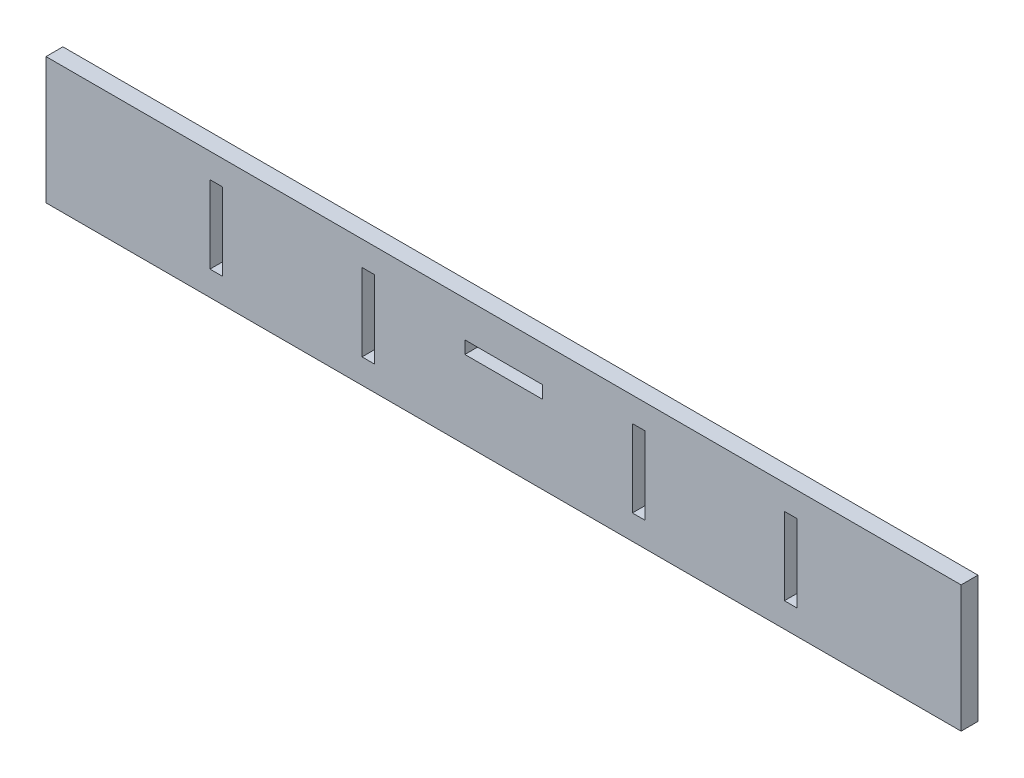
ISO-10303-21;
HEADER;
FILE_DESCRIPTION(('STEP AP214'),'2;1');
FILE_NAME('part.step','',(''),(''),'','','');
FILE_SCHEMA(('AUTOMOTIVE_DESIGN { 1 0 10303 214 1 1 1 1 }'));
ENDSEC;
DATA;
#1=APPLICATION_CONTEXT('core data for automotive mechanical design processes');
#2=APPLICATION_PROTOCOL_DEFINITION('international standard','automotive_design',2000,#1);
#3=PRODUCT_CONTEXT('',#1,'mechanical');
#4=PRODUCT('Part','Part','',(#3));
#5=PRODUCT_RELATED_PRODUCT_CATEGORY('part','',(#4));
#6=PRODUCT_DEFINITION_FORMATION('','',#4);
#7=PRODUCT_DEFINITION_CONTEXT('part definition',#1,'design');
#8=PRODUCT_DEFINITION('design','',#6,#7);
#9=PRODUCT_DEFINITION_SHAPE('','',#8);
#10=(LENGTH_UNIT() NAMED_UNIT(*) SI_UNIT(.MILLI.,.METRE.));
#11=(NAMED_UNIT(*) PLANE_ANGLE_UNIT() SI_UNIT($,.RADIAN.));
#12=(NAMED_UNIT(*) SI_UNIT($,.STERADIAN.) SOLID_ANGLE_UNIT());
#13=UNCERTAINTY_MEASURE_WITH_UNIT(LENGTH_MEASURE(1.E-05),#10,'distance_accuracy_value','');
#14=(GEOMETRIC_REPRESENTATION_CONTEXT(3) GLOBAL_UNCERTAINTY_ASSIGNED_CONTEXT((#13)) GLOBAL_UNIT_ASSIGNED_CONTEXT((#10,
#11,#12)) REPRESENTATION_CONTEXT('',''));
#15=CARTESIAN_POINT('',(0.,0.,0.));
#16=DIRECTION('',(0.,0.,1.));
#17=DIRECTION('',(1.,0.,0.));
#18=AXIS2_PLACEMENT_3D('',#15,#16,#17);
#19=CARTESIAN_POINT('',(0.,0.,2.4));
#20=DIRECTION('',(0.,0.,-1.));
#21=DIRECTION('',(-1.,0.,0.));
#22=AXIS2_PLACEMENT_3D('',#19,#20,#21);
#23=PLANE('',#22);
#24=DIRECTION('',(0.,-1.,0.));
#25=VECTOR('',#24,1.);
#26=CARTESIAN_POINT('',(-41.7,0.,2.4));
#27=LINE('',#26,#25);
#28=CARTESIAN_POINT('',(-41.7,5.49999999999999,2.4));
#29=VERTEX_POINT('',#28);
#30=CARTESIAN_POINT('',(-41.7,-5.5,2.4));
#31=VERTEX_POINT('',#30);
#32=EDGE_CURVE('E210',#29,#31,#27,.T.);
#33=ORIENTED_EDGE('',*,*,#32,.F.);
#34=DIRECTION('',(-1.,0.,0.));
#35=VECTOR('',#34,1.);
#36=CARTESIAN_POINT('',(0.,5.50000000000021,2.4));
#37=LINE('',#36,#35);
#38=CARTESIAN_POINT('',(-39.9,5.5,2.4));
#39=VERTEX_POINT('',#38);
#40=EDGE_CURVE('E48',#39,#29,#37,.T.);
#41=ORIENTED_EDGE('',*,*,#40,.F.);
#42=DIRECTION('',(0.,1.,0.));
#43=VECTOR('',#42,1.);
#44=CARTESIAN_POINT('',(-39.9,0.,2.4));
#45=LINE('',#44,#43);
#46=CARTESIAN_POINT('',(-39.9,-5.5,2.4));
#47=VERTEX_POINT('',#46);
#48=EDGE_CURVE('E216',#47,#39,#45,.T.);
#49=ORIENTED_EDGE('',*,*,#48,.F.);
#50=DIRECTION('',(-1.,0.,0.));
#51=VECTOR('',#50,1.);
#52=CARTESIAN_POINT('',(0.,-5.4999999999999,2.4));
#53=LINE('',#52,#51);
#54=EDGE_CURVE('E200',#47,#31,#53,.T.);
#55=ORIENTED_EDGE('',*,*,#54,.T.);
#56=EDGE_LOOP('',(#33,#41,#49,#55));
#57=FACE_BOUND('',#56,.T.);
#58=DIRECTION('',(0.,-1.,0.));
#59=VECTOR('',#58,1.);
#60=CARTESIAN_POINT('',(-5.49999999999999,0.,2.4));
#61=LINE('',#60,#59);
#62=CARTESIAN_POINT('',(-5.49999999999999,3.9,2.4));
#63=VERTEX_POINT('',#62);
#64=CARTESIAN_POINT('',(-5.49999999999999,2.1,2.4));
#65=VERTEX_POINT('',#64);
#66=EDGE_CURVE('E250',#63,#65,#61,.T.);
#67=ORIENTED_EDGE('',*,*,#66,.F.);
#68=DIRECTION('',(-1.,0.,0.));
#69=VECTOR('',#68,1.);
#70=CARTESIAN_POINT('',(0.,3.9,2.4));
#71=LINE('',#70,#69);
#72=CARTESIAN_POINT('',(5.50000000000001,3.9,2.4));
#73=VERTEX_POINT('',#72);
#74=EDGE_CURVE('E56',#73,#63,#71,.T.);
#75=ORIENTED_EDGE('',*,*,#74,.F.);
#76=DIRECTION('',(0.,-1.,0.));
#77=VECTOR('',#76,1.);
#78=CARTESIAN_POINT('',(5.50000000000001,0.,2.4));
#79=LINE('',#78,#77);
#80=CARTESIAN_POINT('',(5.50000000000001,2.1,2.4));
#81=VERTEX_POINT('',#80);
#82=EDGE_CURVE('E256',#73,#81,#79,.T.);
#83=ORIENTED_EDGE('',*,*,#82,.T.);
#84=DIRECTION('',(-1.,0.,0.));
#85=VECTOR('',#84,1.);
#86=CARTESIAN_POINT('',(0.,2.1,2.4));
#87=LINE('',#86,#85);
#88=EDGE_CURVE('E253',#81,#65,#87,.T.);
#89=ORIENTED_EDGE('',*,*,#88,.T.);
#90=EDGE_LOOP('',(#67,#75,#83,#89));
#91=FACE_BOUND('',#90,.T.);
#92=DIRECTION('',(-1.,0.,0.));
#93=VECTOR('',#92,1.);
#94=CARTESIAN_POINT('',(0.,-5.50000000000005,2.4));
#95=LINE('',#94,#93);
#96=CARTESIAN_POINT('',(20.1,-5.49999999999999,2.4));
#97=VERTEX_POINT('',#96);
#98=CARTESIAN_POINT('',(18.3,-5.5,2.4));
#99=VERTEX_POINT('',#98);
#100=EDGE_CURVE('E242',#97,#99,#95,.T.);
#101=ORIENTED_EDGE('',*,*,#100,.T.);
#102=DIRECTION('',(0.,-1.,0.));
#103=VECTOR('',#102,1.);
#104=CARTESIAN_POINT('',(18.3,0.,2.4));
#105=LINE('',#104,#103);
#106=CARTESIAN_POINT('',(18.3,5.49999999999999,2.4));
#107=VERTEX_POINT('',#106);
#108=EDGE_CURVE('E296',#107,#99,#105,.T.);
#109=ORIENTED_EDGE('',*,*,#108,.F.);
#110=DIRECTION('',(-1.,0.,0.));
#111=VECTOR('',#110,1.);
#112=CARTESIAN_POINT('',(0.,5.49999999999989,2.4));
#113=LINE('',#112,#111);
#114=CARTESIAN_POINT('',(20.1,5.5,2.4));
#115=VERTEX_POINT('',#114);
#116=EDGE_CURVE('E293',#115,#107,#113,.T.);
#117=ORIENTED_EDGE('',*,*,#116,.F.);
#118=DIRECTION('',(0.,1.,0.));
#119=VECTOR('',#118,1.);
#120=CARTESIAN_POINT('',(20.1,0.,2.4));
#121=LINE('',#120,#119);
#122=EDGE_CURVE('E290',#97,#115,#121,.T.);
#123=ORIENTED_EDGE('',*,*,#122,.F.);
#124=EDGE_LOOP('',(#101,#109,#117,#123));
#125=FACE_BOUND('',#124,.T.);
#126=DIRECTION('',(0.,-1.,0.));
#127=VECTOR('',#126,1.);
#128=CARTESIAN_POINT('',(-65.,8.99999999999999,2.4));
#129=LINE('',#128,#127);
#130=CARTESIAN_POINT('',(-65.,8.99999999999999,2.4));
#131=VERTEX_POINT('',#130);
#132=CARTESIAN_POINT('',(-65.,-9.00000000000001,2.4));
#133=VERTEX_POINT('',#132);
#134=EDGE_CURVE('E307',#131,#133,#129,.T.);
#135=ORIENTED_EDGE('',*,*,#134,.T.);
#136=DIRECTION('',(1.,0.,0.));
#137=VECTOR('',#136,1.);
#138=CARTESIAN_POINT('',(65.,-8.99999999999999,2.4));
#139=LINE('',#138,#137);
#140=CARTESIAN_POINT('',(65.,-8.99999999999999,2.4));
#141=VERTEX_POINT('',#140);
#142=EDGE_CURVE('E310',#133,#141,#139,.T.);
#143=ORIENTED_EDGE('',*,*,#142,.T.);
#144=DIRECTION('',(0.,1.,0.));
#145=VECTOR('',#144,1.);
#146=CARTESIAN_POINT('',(65.,9.00000000000001,2.4));
#147=LINE('',#146,#145);
#148=CARTESIAN_POINT('',(65.,9.00000000000001,2.4));
#149=VERTEX_POINT('',#148);
#150=EDGE_CURVE('E313',#141,#149,#147,.T.);
#151=ORIENTED_EDGE('',*,*,#150,.T.);
#152=DIRECTION('',(-1.,0.,0.));
#153=VECTOR('',#152,1.);
#154=CARTESIAN_POINT('',(65.,9.00000000000001,2.4));
#155=LINE('',#154,#153);
#156=EDGE_CURVE('E315',#149,#131,#155,.T.);
#157=ORIENTED_EDGE('',*,*,#156,.T.);
#158=EDGE_LOOP('',(#135,#143,#151,#157));
#159=FACE_BOUND('',#158,.T.);
#160=DIRECTION('',(0.,-1.,0.));
#161=VECTOR('',#160,1.);
#162=CARTESIAN_POINT('',(-18.3,0.,2.4));
#163=LINE('',#162,#161);
#164=CARTESIAN_POINT('',(-18.3,5.49999999999999,2.4));
#165=VERTEX_POINT('',#164);
#166=CARTESIAN_POINT('',(-18.3,-5.5,2.4));
#167=VERTEX_POINT('',#166);
#168=EDGE_CURVE('E266',#165,#167,#163,.T.);
#169=ORIENTED_EDGE('',*,*,#168,.T.);
#170=DIRECTION('',(1.,0.,0.));
#171=VECTOR('',#170,1.);
#172=CARTESIAN_POINT('',(0.,-5.50000000000004,2.4));
#173=LINE('',#172,#171);
#174=CARTESIAN_POINT('',(-20.1,-5.5,2.4));
#175=VERTEX_POINT('',#174);
#176=EDGE_CURVE('E276',#175,#167,#173,.T.);
#177=ORIENTED_EDGE('',*,*,#176,.F.);
#178=DIRECTION('',(0.,1.,0.));
#179=VECTOR('',#178,1.);
#180=CARTESIAN_POINT('',(-20.1,0.,2.4));
#181=LINE('',#180,#179);
#182=CARTESIAN_POINT('',(-20.1,5.5,2.4));
#183=VERTEX_POINT('',#182);
#184=EDGE_CURVE('E273',#175,#183,#181,.T.);
#185=ORIENTED_EDGE('',*,*,#184,.T.);
#186=DIRECTION('',(1.,0.,0.));
#187=VECTOR('',#186,1.);
#188=CARTESIAN_POINT('',(0.,5.49999999999989,2.4));
#189=LINE('',#188,#187);
#190=EDGE_CURVE('E269',#183,#165,#189,.T.);
#191=ORIENTED_EDGE('',*,*,#190,.T.);
#192=EDGE_LOOP('',(#169,#177,#185,#191));
#193=FACE_BOUND('',#192,.T.);
#194=DIRECTION('',(0.,-1.,0.));
#195=VECTOR('',#194,1.);
#196=CARTESIAN_POINT('',(41.7,0.,2.4));
#197=LINE('',#196,#195);
#198=CARTESIAN_POINT('',(41.7,5.5,2.4));
#199=VERTEX_POINT('',#198);
#200=CARTESIAN_POINT('',(41.7,-5.49999999999999,2.4));
#201=VERTEX_POINT('',#200);
#202=EDGE_CURVE('E226',#199,#201,#197,.T.);
#203=ORIENTED_EDGE('',*,*,#202,.T.);
#204=DIRECTION('',(1.,0.,0.));
#205=VECTOR('',#204,1.);
#206=CARTESIAN_POINT('',(0.,-5.49999999999991,2.4));
#207=LINE('',#206,#205);
#208=CARTESIAN_POINT('',(39.9,-5.49999999999999,2.4));
#209=VERTEX_POINT('',#208);
#210=EDGE_CURVE('E236',#209,#201,#207,.T.);
#211=ORIENTED_EDGE('',*,*,#210,.F.);
#212=DIRECTION('',(0.,1.,0.));
#213=VECTOR('',#212,1.);
#214=CARTESIAN_POINT('',(39.9,0.,2.4));
#215=LINE('',#214,#213);
#216=CARTESIAN_POINT('',(39.9,5.50000000000001,2.4));
#217=VERTEX_POINT('',#216);
#218=EDGE_CURVE('E233',#209,#217,#215,.T.);
#219=ORIENTED_EDGE('',*,*,#218,.T.);
#220=DIRECTION('',(1.,0.,0.));
#221=VECTOR('',#220,1.);
#222=CARTESIAN_POINT('',(0.,5.5000000000002,2.4));
#223=LINE('',#222,#221);
#224=EDGE_CURVE('E229',#217,#199,#223,.T.);
#225=ORIENTED_EDGE('',*,*,#224,.T.);
#226=EDGE_LOOP('',(#203,#211,#219,#225));
#227=FACE_BOUND('',#226,.T.);
#228=ADVANCED_FACE('F33',(#57,#91,#125,#159,#193,#227),#23,.F.);
#229=CARTESIAN_POINT('',(0.,0.,0.));
#230=DIRECTION('',(0.,0.,-1.));
#231=DIRECTION('',(-1.,0.,0.));
#232=AXIS2_PLACEMENT_3D('',#229,#230,#231);
#233=PLANE('',#232);
#234=DIRECTION('',(1.,0.,0.));
#235=VECTOR('',#234,1.);
#236=CARTESIAN_POINT('',(0.,5.50000000000021,0.));
#237=LINE('',#236,#235);
#238=CARTESIAN_POINT('',(-41.7,5.49999999999999,0.));
#239=VERTEX_POINT('',#238);
#240=CARTESIAN_POINT('',(-39.9,5.5,0.));
#241=VERTEX_POINT('',#240);
#242=EDGE_CURVE('E11',#239,#241,#237,.T.);
#243=ORIENTED_EDGE('',*,*,#242,.F.);
#244=DIRECTION('',(0.,1.,0.));
#245=VECTOR('',#244,1.);
#246=CARTESIAN_POINT('',(-41.7,0.,0.));
#247=LINE('',#246,#245);
#248=CARTESIAN_POINT('',(-41.7,-5.5,0.));
#249=VERTEX_POINT('',#248);
#250=EDGE_CURVE('E378',#249,#239,#247,.T.);
#251=ORIENTED_EDGE('',*,*,#250,.F.);
#252=DIRECTION('',(1.,0.,0.));
#253=VECTOR('',#252,1.);
#254=CARTESIAN_POINT('',(0.,-5.4999999999999,0.));
#255=LINE('',#254,#253);
#256=CARTESIAN_POINT('',(-39.9,-5.5,0.));
#257=VERTEX_POINT('',#256);
#258=EDGE_CURVE('E203',#249,#257,#255,.T.);
#259=ORIENTED_EDGE('',*,*,#258,.T.);
#260=DIRECTION('',(0.,-1.,0.));
#261=VECTOR('',#260,1.);
#262=CARTESIAN_POINT('',(-39.9,0.,0.));
#263=LINE('',#262,#261);
#264=EDGE_CURVE('E41',#241,#257,#263,.T.);
#265=ORIENTED_EDGE('',*,*,#264,.F.);
#266=EDGE_LOOP('',(#243,#251,#259,#265));
#267=FACE_BOUND('',#266,.T.);
#268=DIRECTION('',(1.,0.,0.));
#269=VECTOR('',#268,1.);
#270=CARTESIAN_POINT('',(0.,3.9,0.));
#271=LINE('',#270,#269);
#272=CARTESIAN_POINT('',(-5.49999999999999,3.9,0.));
#273=VERTEX_POINT('',#272);
#274=CARTESIAN_POINT('',(5.50000000000001,3.9,0.));
#275=VERTEX_POINT('',#274);
#276=EDGE_CURVE('E376',#273,#275,#271,.T.);
#277=ORIENTED_EDGE('',*,*,#276,.F.);
#278=DIRECTION('',(0.,1.,0.));
#279=VECTOR('',#278,1.);
#280=CARTESIAN_POINT('',(-5.49999999999999,0.,0.));
#281=LINE('',#280,#279);
#282=CARTESIAN_POINT('',(-5.49999999999999,2.1,0.));
#283=VERTEX_POINT('',#282);
#284=EDGE_CURVE('E368',#283,#273,#281,.T.);
#285=ORIENTED_EDGE('',*,*,#284,.F.);
#286=DIRECTION('',(1.,0.,0.));
#287=VECTOR('',#286,1.);
#288=CARTESIAN_POINT('',(0.,2.1,0.));
#289=LINE('',#288,#287);
#290=CARTESIAN_POINT('',(5.50000000000001,2.1,0.));
#291=VERTEX_POINT('',#290);
#292=EDGE_CURVE('E370',#283,#291,#289,.T.);
#293=ORIENTED_EDGE('',*,*,#292,.T.);
#294=DIRECTION('',(0.,1.,0.));
#295=VECTOR('',#294,1.);
#296=CARTESIAN_POINT('',(5.50000000000001,0.,0.));
#297=LINE('',#296,#295);
#298=EDGE_CURVE('E373',#291,#275,#297,.T.);
#299=ORIENTED_EDGE('',*,*,#298,.T.);
#300=EDGE_LOOP('',(#277,#285,#293,#299));
#301=FACE_BOUND('',#300,.T.);
#302=DIRECTION('',(0.,-1.,0.));
#303=VECTOR('',#302,1.);
#304=CARTESIAN_POINT('',(-65.,8.99999999999999,0.));
#305=LINE('',#304,#303);
#306=CARTESIAN_POINT('',(-65.,8.99999999999999,0.));
#307=VERTEX_POINT('',#306);
#308=CARTESIAN_POINT('',(-65.,-9.00000000000001,0.));
#309=VERTEX_POINT('',#308);
#310=EDGE_CURVE('E223',#307,#309,#305,.T.);
#311=ORIENTED_EDGE('',*,*,#310,.F.);
#312=DIRECTION('',(-1.,0.,0.));
#313=VECTOR('',#312,1.);
#314=CARTESIAN_POINT('',(65.,9.00000000000001,0.));
#315=LINE('',#314,#313);
#316=CARTESIAN_POINT('',(65.,9.00000000000001,0.));
#317=VERTEX_POINT('',#316);
#318=EDGE_CURVE('E311',#317,#307,#315,.T.);
#319=ORIENTED_EDGE('',*,*,#318,.F.);
#320=DIRECTION('',(0.,1.,0.));
#321=VECTOR('',#320,1.);
#322=CARTESIAN_POINT('',(65.,9.00000000000001,0.));
#323=LINE('',#322,#321);
#324=CARTESIAN_POINT('',(65.,-8.99999999999999,0.));
#325=VERTEX_POINT('',#324);
#326=EDGE_CURVE('E322',#325,#317,#323,.T.);
#327=ORIENTED_EDGE('',*,*,#326,.F.);
#328=DIRECTION('',(1.,0.,0.));
#329=VECTOR('',#328,1.);
#330=CARTESIAN_POINT('',(65.,-8.99999999999999,0.));
#331=LINE('',#330,#329);
#332=EDGE_CURVE('E320',#309,#325,#331,.T.);
#333=ORIENTED_EDGE('',*,*,#332,.F.);
#334=EDGE_LOOP('',(#311,#319,#327,#333));
#335=FACE_BOUND('',#334,.T.);
#336=DIRECTION('',(-1.,0.,0.));
#337=VECTOR('',#336,1.);
#338=CARTESIAN_POINT('',(0.,-5.50000000000004,0.));
#339=LINE('',#338,#337);
#340=CARTESIAN_POINT('',(-18.3,-5.5,0.));
#341=VERTEX_POINT('',#340);
#342=CARTESIAN_POINT('',(-20.1,-5.5,0.));
#343=VERTEX_POINT('',#342);
#344=EDGE_CURVE('E342',#341,#343,#339,.T.);
#345=ORIENTED_EDGE('',*,*,#344,.F.);
#346=DIRECTION('',(0.,1.,0.));
#347=VECTOR('',#346,1.);
#348=CARTESIAN_POINT('',(-18.3,0.,0.));
#349=LINE('',#348,#347);
#350=CARTESIAN_POINT('',(-18.3,5.49999999999999,0.));
#351=VERTEX_POINT('',#350);
#352=EDGE_CURVE('E344',#341,#351,#349,.T.);
#353=ORIENTED_EDGE('',*,*,#352,.T.);
#354=DIRECTION('',(-1.,0.,0.));
#355=VECTOR('',#354,1.);
#356=CARTESIAN_POINT('',(0.,5.49999999999989,0.));
#357=LINE('',#356,#355);
#358=CARTESIAN_POINT('',(-20.1,5.5,0.));
#359=VERTEX_POINT('',#358);
#360=EDGE_CURVE('E336',#351,#359,#357,.T.);
#361=ORIENTED_EDGE('',*,*,#360,.T.);
#362=DIRECTION('',(0.,-1.,0.));
#363=VECTOR('',#362,1.);
#364=CARTESIAN_POINT('',(-20.1,0.,0.));
#365=LINE('',#364,#363);
#366=EDGE_CURVE('E339',#359,#343,#365,.T.);
#367=ORIENTED_EDGE('',*,*,#366,.T.);
#368=EDGE_LOOP('',(#345,#353,#361,#367));
#369=FACE_BOUND('',#368,.T.);
#370=DIRECTION('',(0.,1.,0.));
#371=VECTOR('',#370,1.);
#372=CARTESIAN_POINT('',(18.3,0.,0.));
#373=LINE('',#372,#371);
#374=CARTESIAN_POINT('',(18.3,-5.5,0.));
#375=VERTEX_POINT('',#374);
#376=CARTESIAN_POINT('',(18.3,5.49999999999999,0.));
#377=VERTEX_POINT('',#376);
#378=EDGE_CURVE('E352',#375,#377,#373,.T.);
#379=ORIENTED_EDGE('',*,*,#378,.F.);
#380=DIRECTION('',(1.,0.,0.));
#381=VECTOR('',#380,1.);
#382=CARTESIAN_POINT('',(0.,-5.50000000000005,0.));
#383=LINE('',#382,#381);
#384=CARTESIAN_POINT('',(20.1,-5.49999999999999,0.));
#385=VERTEX_POINT('',#384);
#386=EDGE_CURVE('E354',#375,#385,#383,.T.);
#387=ORIENTED_EDGE('',*,*,#386,.T.);
#388=DIRECTION('',(0.,-1.,0.));
#389=VECTOR('',#388,1.);
#390=CARTESIAN_POINT('',(20.1,0.,0.));
#391=LINE('',#390,#389);
#392=CARTESIAN_POINT('',(20.1,5.5,0.));
#393=VERTEX_POINT('',#392);
#394=EDGE_CURVE('E347',#393,#385,#391,.T.);
#395=ORIENTED_EDGE('',*,*,#394,.F.);
#396=DIRECTION('',(1.,0.,0.));
#397=VECTOR('',#396,1.);
#398=CARTESIAN_POINT('',(0.,5.49999999999989,0.));
#399=LINE('',#398,#397);
#400=EDGE_CURVE('E349',#377,#393,#399,.T.);
#401=ORIENTED_EDGE('',*,*,#400,.F.);
#402=EDGE_LOOP('',(#379,#387,#395,#401));
#403=FACE_BOUND('',#402,.T.);
#404=DIRECTION('',(-1.,0.,0.));
#405=VECTOR('',#404,1.);
#406=CARTESIAN_POINT('',(0.,-5.49999999999991,0.));
#407=LINE('',#406,#405);
#408=CARTESIAN_POINT('',(41.7,-5.49999999999999,0.));
#409=VERTEX_POINT('',#408);
#410=CARTESIAN_POINT('',(39.9,-5.49999999999999,0.));
#411=VERTEX_POINT('',#410);
#412=EDGE_CURVE('E363',#409,#411,#407,.T.);
#413=ORIENTED_EDGE('',*,*,#412,.F.);
#414=DIRECTION('',(0.,1.,0.));
#415=VECTOR('',#414,1.);
#416=CARTESIAN_POINT('',(41.7,0.,0.));
#417=LINE('',#416,#415);
#418=CARTESIAN_POINT('',(41.7,5.5,0.));
#419=VERTEX_POINT('',#418);
#420=EDGE_CURVE('E365',#409,#419,#417,.T.);
#421=ORIENTED_EDGE('',*,*,#420,.T.);
#422=DIRECTION('',(-1.,0.,0.));
#423=VECTOR('',#422,1.);
#424=CARTESIAN_POINT('',(0.,5.5000000000002,0.));
#425=LINE('',#424,#423);
#426=CARTESIAN_POINT('',(39.9,5.50000000000001,0.));
#427=VERTEX_POINT('',#426);
#428=EDGE_CURVE('E357',#419,#427,#425,.T.);
#429=ORIENTED_EDGE('',*,*,#428,.T.);
#430=DIRECTION('',(0.,-1.,0.));
#431=VECTOR('',#430,1.);
#432=CARTESIAN_POINT('',(39.9,0.,0.));
#433=LINE('',#432,#431);
#434=EDGE_CURVE('E360',#427,#411,#433,.T.);
#435=ORIENTED_EDGE('',*,*,#434,.T.);
#436=EDGE_LOOP('',(#413,#421,#429,#435));
#437=FACE_BOUND('',#436,.T.);
#438=ADVANCED_FACE('F386',(#267,#301,#335,#369,#403,#437),#233,.T.);
#439=CARTESIAN_POINT('',(-65.,8.99999999999999,2.4));
#440=DIRECTION('',(1.,0.,0.));
#441=DIRECTION('',(0.,0.,-1.));
#442=AXIS2_PLACEMENT_3D('',#439,#440,#441);
#443=PLANE('',#442);
#444=ORIENTED_EDGE('',*,*,#310,.T.);
#445=DIRECTION('',(0.,0.,-1.));
#446=VECTOR('',#445,1.);
#447=CARTESIAN_POINT('',(-65.,-9.00000000000001,2.4));
#448=LINE('',#447,#446);
#449=EDGE_CURVE('E333',#133,#309,#448,.T.);
#450=ORIENTED_EDGE('',*,*,#449,.F.);
#451=ORIENTED_EDGE('',*,*,#134,.F.);
#452=DIRECTION('',(0.,0.,-1.));
#453=VECTOR('',#452,1.);
#454=CARTESIAN_POINT('',(-65.,8.99999999999999,2.4));
#455=LINE('',#454,#453);
#456=EDGE_CURVE('E317',#131,#307,#455,.T.);
#457=ORIENTED_EDGE('',*,*,#456,.T.);
#458=EDGE_LOOP('',(#444,#450,#451,#457));
#459=FACE_BOUND('',#458,.T.);
#460=ADVANCED_FACE('F35',(#459),#443,.F.);
#461=CARTESIAN_POINT('',(65.,-8.99999999999999,2.4));
#462=DIRECTION('',(0.,1.,0.));
#463=DIRECTION('',(-1.,0.,0.));
#464=AXIS2_PLACEMENT_3D('',#461,#462,#463);
#465=PLANE('',#464);
#466=ORIENTED_EDGE('',*,*,#332,.T.);
#467=DIRECTION('',(0.,0.,-1.));
#468=VECTOR('',#467,1.);
#469=CARTESIAN_POINT('',(65.,-8.99999999999999,2.4));
#470=LINE('',#469,#468);
#471=EDGE_CURVE('E330',#141,#325,#470,.T.);
#472=ORIENTED_EDGE('',*,*,#471,.F.);
#473=ORIENTED_EDGE('',*,*,#142,.F.);
#474=ORIENTED_EDGE('',*,*,#449,.T.);
#475=EDGE_LOOP('',(#466,#472,#473,#474));
#476=FACE_BOUND('',#475,.T.);
#477=ADVANCED_FACE('F419',(#476),#465,.F.);
#478=CARTESIAN_POINT('',(65.,9.00000000000001,2.4));
#479=DIRECTION('',(-1.,0.,0.));
#480=DIRECTION('',(0.,0.,1.));
#481=AXIS2_PLACEMENT_3D('',#478,#479,#480);
#482=PLANE('',#481);
#483=ORIENTED_EDGE('',*,*,#326,.T.);
#484=DIRECTION('',(0.,0.,-1.));
#485=VECTOR('',#484,1.);
#486=CARTESIAN_POINT('',(65.,9.00000000000001,2.4));
#487=LINE('',#486,#485);
#488=EDGE_CURVE('E327',#149,#317,#487,.T.);
#489=ORIENTED_EDGE('',*,*,#488,.F.);
#490=ORIENTED_EDGE('',*,*,#150,.F.);
#491=ORIENTED_EDGE('',*,*,#471,.T.);
#492=EDGE_LOOP('',(#483,#489,#490,#491));
#493=FACE_BOUND('',#492,.T.);
#494=ADVANCED_FACE('F416',(#493),#482,.F.);
#495=CARTESIAN_POINT('',(65.,9.00000000000001,2.4));
#496=DIRECTION('',(0.,-1.,0.));
#497=DIRECTION('',(1.,0.,0.));
#498=AXIS2_PLACEMENT_3D('',#495,#496,#497);
#499=PLANE('',#498);
#500=ORIENTED_EDGE('',*,*,#318,.T.);
#501=ORIENTED_EDGE('',*,*,#456,.F.);
#502=ORIENTED_EDGE('',*,*,#156,.F.);
#503=ORIENTED_EDGE('',*,*,#488,.T.);
#504=EDGE_LOOP('',(#500,#501,#502,#503));
#505=FACE_BOUND('',#504,.T.);
#506=ADVANCED_FACE('F412',(#505),#499,.F.);
#507=CARTESIAN_POINT('',(-18.3,0.,-8.6));
#508=DIRECTION('',(-1.,0.,0.));
#509=DIRECTION('',(0.,-1.,0.));
#510=AXIS2_PLACEMENT_3D('',#507,#508,#509);
#511=PLANE('',#510);
#512=DIRECTION('',(0.,0.,1.));
#513=VECTOR('',#512,1.);
#514=CARTESIAN_POINT('',(-18.3,-5.5,-8.6));
#515=LINE('',#514,#513);
#516=EDGE_CURVE('E280',#341,#167,#515,.T.);
#517=ORIENTED_EDGE('',*,*,#516,.T.);
#518=ORIENTED_EDGE('',*,*,#168,.F.);
#519=DIRECTION('',(0.,0.,1.));
#520=VECTOR('',#519,1.);
#521=CARTESIAN_POINT('',(-18.3,5.49999999999999,-8.6));
#522=LINE('',#521,#520);
#523=EDGE_CURVE('E279',#351,#165,#522,.T.);
#524=ORIENTED_EDGE('',*,*,#523,.F.);
#525=ORIENTED_EDGE('',*,*,#352,.F.);
#526=EDGE_LOOP('',(#517,#518,#524,#525));
#527=FACE_BOUND('',#526,.T.);
#528=ADVANCED_FACE('F415',(#527),#511,.T.);
#529=CARTESIAN_POINT('',(0.,-5.50000000000004,-8.6));
#530=DIRECTION('',(0.,-1.,0.));
#531=DIRECTION('',(1.,0.,0.));
#532=AXIS2_PLACEMENT_3D('',#529,#530,#531);
#533=PLANE('',#532);
#534=ORIENTED_EDGE('',*,*,#344,.T.);
#535=DIRECTION('',(0.,0.,1.));
#536=VECTOR('',#535,1.);
#537=CARTESIAN_POINT('',(-20.1,-5.5,-8.6));
#538=LINE('',#537,#536);
#539=EDGE_CURVE('E282',#343,#175,#538,.T.);
#540=ORIENTED_EDGE('',*,*,#539,.T.);
#541=ORIENTED_EDGE('',*,*,#176,.T.);
#542=ORIENTED_EDGE('',*,*,#516,.F.);
#543=EDGE_LOOP('',(#534,#540,#541,#542));
#544=FACE_BOUND('',#543,.T.);
#545=ADVANCED_FACE('F481',(#544),#533,.F.);
#546=CARTESIAN_POINT('',(-20.1,0.,-8.6));
#547=DIRECTION('',(1.,0.,0.));
#548=DIRECTION('',(0.,1.,0.));
#549=AXIS2_PLACEMENT_3D('',#546,#547,#548);
#550=PLANE('',#549);
#551=DIRECTION('',(0.,0.,1.));
#552=VECTOR('',#551,1.);
#553=CARTESIAN_POINT('',(-20.1,5.5,-8.6));
#554=LINE('',#553,#552);
#555=EDGE_CURVE('E284',#359,#183,#554,.T.);
#556=ORIENTED_EDGE('',*,*,#555,.T.);
#557=ORIENTED_EDGE('',*,*,#184,.F.);
#558=ORIENTED_EDGE('',*,*,#539,.F.);
#559=ORIENTED_EDGE('',*,*,#366,.F.);
#560=EDGE_LOOP('',(#556,#557,#558,#559));
#561=FACE_BOUND('',#560,.T.);
#562=ADVANCED_FACE('F484',(#561),#550,.T.);
#563=CARTESIAN_POINT('',(0.,5.49999999999989,-8.6));
#564=DIRECTION('',(0.,-1.,0.));
#565=DIRECTION('',(1.,0.,0.));
#566=AXIS2_PLACEMENT_3D('',#563,#564,#565);
#567=PLANE('',#566);
#568=ORIENTED_EDGE('',*,*,#523,.T.);
#569=ORIENTED_EDGE('',*,*,#190,.F.);
#570=ORIENTED_EDGE('',*,*,#555,.F.);
#571=ORIENTED_EDGE('',*,*,#360,.F.);
#572=EDGE_LOOP('',(#568,#569,#570,#571));
#573=FACE_BOUND('',#572,.T.);
#574=ADVANCED_FACE('F488',(#573),#567,.T.);
#575=CARTESIAN_POINT('',(0.,-5.50000000000005,-8.6));
#576=DIRECTION('',(0.,1.,0.));
#577=DIRECTION('',(-1.,0.,0.));
#578=AXIS2_PLACEMENT_3D('',#575,#576,#577);
#579=PLANE('',#578);
#580=DIRECTION('',(0.,0.,1.));
#581=VECTOR('',#580,1.);
#582=CARTESIAN_POINT('',(18.3,-5.5,-8.6));
#583=LINE('',#582,#581);
#584=EDGE_CURVE('E270',#375,#99,#583,.T.);
#585=ORIENTED_EDGE('',*,*,#584,.T.);
#586=ORIENTED_EDGE('',*,*,#100,.F.);
#587=DIRECTION('',(0.,0.,1.));
#588=VECTOR('',#587,1.);
#589=CARTESIAN_POINT('',(20.1,-5.49999999999999,-8.6));
#590=LINE('',#589,#588);
#591=EDGE_CURVE('E299',#385,#97,#590,.T.);
#592=ORIENTED_EDGE('',*,*,#591,.F.);
#593=ORIENTED_EDGE('',*,*,#386,.F.);
#594=EDGE_LOOP('',(#585,#586,#592,#593));
#595=FACE_BOUND('',#594,.T.);
#596=ADVANCED_FACE('F409',(#595),#579,.T.);
#597=CARTESIAN_POINT('',(18.3,0.,-8.6));
#598=DIRECTION('',(-1.,0.,0.));
#599=DIRECTION('',(0.,-1.,0.));
#600=AXIS2_PLACEMENT_3D('',#597,#598,#599);
#601=PLANE('',#600);
#602=ORIENTED_EDGE('',*,*,#378,.T.);
#603=DIRECTION('',(0.,0.,1.));
#604=VECTOR('',#603,1.);
#605=CARTESIAN_POINT('',(18.3,5.49999999999999,-8.6));
#606=LINE('',#605,#604);
#607=EDGE_CURVE('E301',#377,#107,#606,.T.);
#608=ORIENTED_EDGE('',*,*,#607,.T.);
#609=ORIENTED_EDGE('',*,*,#108,.T.);
#610=ORIENTED_EDGE('',*,*,#584,.F.);
#611=EDGE_LOOP('',(#602,#608,#609,#610));
#612=FACE_BOUND('',#611,.T.);
#613=ADVANCED_FACE('F496',(#612),#601,.F.);
#614=CARTESIAN_POINT('',(0.,5.49999999999989,-8.6));
#615=DIRECTION('',(0.,1.,0.));
#616=DIRECTION('',(-1.,0.,0.));
#617=AXIS2_PLACEMENT_3D('',#614,#615,#616);
#618=PLANE('',#617);
#619=ORIENTED_EDGE('',*,*,#400,.T.);
#620=DIRECTION('',(0.,0.,1.));
#621=VECTOR('',#620,1.);
#622=CARTESIAN_POINT('',(20.1,5.5,-8.6));
#623=LINE('',#622,#621);
#624=EDGE_CURVE('E303',#393,#115,#623,.T.);
#625=ORIENTED_EDGE('',*,*,#624,.T.);
#626=ORIENTED_EDGE('',*,*,#116,.T.);
#627=ORIENTED_EDGE('',*,*,#607,.F.);
#628=EDGE_LOOP('',(#619,#625,#626,#627));
#629=FACE_BOUND('',#628,.T.);
#630=ADVANCED_FACE('F499',(#629),#618,.F.);
#631=CARTESIAN_POINT('',(20.1,0.,-8.6));
#632=DIRECTION('',(1.,0.,0.));
#633=DIRECTION('',(0.,1.,0.));
#634=AXIS2_PLACEMENT_3D('',#631,#632,#633);
#635=PLANE('',#634);
#636=ORIENTED_EDGE('',*,*,#394,.T.);
#637=ORIENTED_EDGE('',*,*,#591,.T.);
#638=ORIENTED_EDGE('',*,*,#122,.T.);
#639=ORIENTED_EDGE('',*,*,#624,.F.);
#640=EDGE_LOOP('',(#636,#637,#638,#639));
#641=FACE_BOUND('',#640,.T.);
#642=ADVANCED_FACE('F471',(#641),#635,.F.);
#643=CARTESIAN_POINT('',(41.7,0.,-8.6));
#644=DIRECTION('',(-1.,0.,0.));
#645=DIRECTION('',(0.,0.,1.));
#646=AXIS2_PLACEMENT_3D('',#643,#644,#645);
#647=PLANE('',#646);
#648=DIRECTION('',(0.,0.,1.));
#649=VECTOR('',#648,1.);
#650=CARTESIAN_POINT('',(41.7,-5.49999999999999,-8.6));
#651=LINE('',#650,#649);
#652=EDGE_CURVE('E240',#409,#201,#651,.T.);
#653=ORIENTED_EDGE('',*,*,#652,.T.);
#654=ORIENTED_EDGE('',*,*,#202,.F.);
#655=DIRECTION('',(0.,0.,1.));
#656=VECTOR('',#655,1.);
#657=CARTESIAN_POINT('',(41.7,5.5,-8.6));
#658=LINE('',#657,#656);
#659=EDGE_CURVE('E239',#419,#199,#658,.T.);
#660=ORIENTED_EDGE('',*,*,#659,.F.);
#661=ORIENTED_EDGE('',*,*,#420,.F.);
#662=EDGE_LOOP('',(#653,#654,#660,#661));
#663=FACE_BOUND('',#662,.T.);
#664=ADVANCED_FACE('F447',(#663),#647,.T.);
#665=CARTESIAN_POINT('',(0.,-5.49999999999991,-8.6));
#666=DIRECTION('',(0.,-1.,0.));
#667=DIRECTION('',(1.,0.,0.));
#668=AXIS2_PLACEMENT_3D('',#665,#666,#667);
#669=PLANE('',#668);
#670=ORIENTED_EDGE('',*,*,#412,.T.);
#671=DIRECTION('',(0.,0.,1.));
#672=VECTOR('',#671,1.);
#673=CARTESIAN_POINT('',(39.9,-5.49999999999999,-8.6));
#674=LINE('',#673,#672);
#675=EDGE_CURVE('E243',#411,#209,#674,.T.);
#676=ORIENTED_EDGE('',*,*,#675,.T.);
#677=ORIENTED_EDGE('',*,*,#210,.T.);
#678=ORIENTED_EDGE('',*,*,#652,.F.);
#679=EDGE_LOOP('',(#670,#676,#677,#678));
#680=FACE_BOUND('',#679,.T.);
#681=ADVANCED_FACE('F455',(#680),#669,.F.);
#682=CARTESIAN_POINT('',(39.9,0.,-8.6));
#683=DIRECTION('',(1.,0.,0.));
#684=DIRECTION('',(0.,0.,-1.));
#685=AXIS2_PLACEMENT_3D('',#682,#683,#684);
#686=PLANE('',#685);
#687=DIRECTION('',(0.,0.,1.));
#688=VECTOR('',#687,1.);
#689=CARTESIAN_POINT('',(39.9,5.50000000000001,-8.6));
#690=LINE('',#689,#688);
#691=EDGE_CURVE('E245',#427,#217,#690,.T.);
#692=ORIENTED_EDGE('',*,*,#691,.T.);
#693=ORIENTED_EDGE('',*,*,#218,.F.);
#694=ORIENTED_EDGE('',*,*,#675,.F.);
#695=ORIENTED_EDGE('',*,*,#434,.F.);
#696=EDGE_LOOP('',(#692,#693,#694,#695));
#697=FACE_BOUND('',#696,.T.);
#698=ADVANCED_FACE('F459',(#697),#686,.T.);
#699=CARTESIAN_POINT('',(0.,5.5000000000002,-8.6));
#700=DIRECTION('',(0.,-1.,0.));
#701=DIRECTION('',(1.,0.,0.));
#702=AXIS2_PLACEMENT_3D('',#699,#700,#701);
#703=PLANE('',#702);
#704=ORIENTED_EDGE('',*,*,#659,.T.);
#705=ORIENTED_EDGE('',*,*,#224,.F.);
#706=ORIENTED_EDGE('',*,*,#691,.F.);
#707=ORIENTED_EDGE('',*,*,#428,.F.);
#708=EDGE_LOOP('',(#704,#705,#706,#707));
#709=FACE_BOUND('',#708,.T.);
#710=ADVANCED_FACE('F450',(#709),#703,.T.);
#711=CARTESIAN_POINT('',(0.,3.9,-8.6));
#712=DIRECTION('',(0.,1.,0.));
#713=DIRECTION('',(-1.,0.,0.));
#714=AXIS2_PLACEMENT_3D('',#711,#712,#713);
#715=PLANE('',#714);
#716=ORIENTED_EDGE('',*,*,#276,.T.);
#717=DIRECTION('',(0.,0.,1.));
#718=VECTOR('',#717,1.);
#719=CARTESIAN_POINT('',(5.50000000000001,3.9,-8.6));
#720=LINE('',#719,#718);
#721=EDGE_CURVE('E230',#275,#73,#720,.T.);
#722=ORIENTED_EDGE('',*,*,#721,.T.);
#723=ORIENTED_EDGE('',*,*,#74,.T.);
#724=DIRECTION('',(0.,0.,1.));
#725=VECTOR('',#724,1.);
#726=CARTESIAN_POINT('',(-5.49999999999999,3.9,-8.6));
#727=LINE('',#726,#725);
#728=EDGE_CURVE('E259',#273,#63,#727,.T.);
#729=ORIENTED_EDGE('',*,*,#728,.F.);
#730=EDGE_LOOP('',(#716,#722,#723,#729));
#731=FACE_BOUND('',#730,.T.);
#732=ADVANCED_FACE('F466',(#731),#715,.F.);
#733=CARTESIAN_POINT('',(5.50000000000001,0.,-8.6));
#734=DIRECTION('',(-1.,0.,0.));
#735=DIRECTION('',(0.,0.,1.));
#736=AXIS2_PLACEMENT_3D('',#733,#734,#735);
#737=PLANE('',#736);
#738=DIRECTION('',(0.,0.,1.));
#739=VECTOR('',#738,1.);
#740=CARTESIAN_POINT('',(5.50000000000001,2.1,-8.6));
#741=LINE('',#740,#739);
#742=EDGE_CURVE('E261',#291,#81,#741,.T.);
#743=ORIENTED_EDGE('',*,*,#742,.T.);
#744=ORIENTED_EDGE('',*,*,#82,.F.);
#745=ORIENTED_EDGE('',*,*,#721,.F.);
#746=ORIENTED_EDGE('',*,*,#298,.F.);
#747=EDGE_LOOP('',(#743,#744,#745,#746));
#748=FACE_BOUND('',#747,.T.);
#749=ADVANCED_FACE('F472',(#748),#737,.T.);
#750=CARTESIAN_POINT('',(0.,2.1,-8.6));
#751=DIRECTION('',(0.,1.,0.));
#752=DIRECTION('',(-1.,0.,0.));
#753=AXIS2_PLACEMENT_3D('',#750,#751,#752);
#754=PLANE('',#753);
#755=DIRECTION('',(0.,0.,1.));
#756=VECTOR('',#755,1.);
#757=CARTESIAN_POINT('',(-5.49999999999999,2.1,-8.6));
#758=LINE('',#757,#756);
#759=EDGE_CURVE('E263',#283,#65,#758,.T.);
#760=ORIENTED_EDGE('',*,*,#759,.T.);
#761=ORIENTED_EDGE('',*,*,#88,.F.);
#762=ORIENTED_EDGE('',*,*,#742,.F.);
#763=ORIENTED_EDGE('',*,*,#292,.F.);
#764=EDGE_LOOP('',(#760,#761,#762,#763));
#765=FACE_BOUND('',#764,.T.);
#766=ADVANCED_FACE('F397',(#765),#754,.T.);
#767=CARTESIAN_POINT('',(-5.49999999999999,0.,-8.6));
#768=DIRECTION('',(-1.,0.,0.));
#769=DIRECTION('',(0.,0.,1.));
#770=AXIS2_PLACEMENT_3D('',#767,#768,#769);
#771=PLANE('',#770);
#772=ORIENTED_EDGE('',*,*,#284,.T.);
#773=ORIENTED_EDGE('',*,*,#728,.T.);
#774=ORIENTED_EDGE('',*,*,#66,.T.);
#775=ORIENTED_EDGE('',*,*,#759,.F.);
#776=EDGE_LOOP('',(#772,#773,#774,#775));
#777=FACE_BOUND('',#776,.T.);
#778=ADVANCED_FACE('F390',(#777),#771,.F.);
#779=CARTESIAN_POINT('',(0.,5.50000000000021,-8.6));
#780=DIRECTION('',(0.,1.,0.));
#781=DIRECTION('',(-1.,0.,0.));
#782=AXIS2_PLACEMENT_3D('',#779,#780,#781);
#783=PLANE('',#782);
#784=ORIENTED_EDGE('',*,*,#242,.T.);
#785=DIRECTION('',(0.,0.,1.));
#786=VECTOR('',#785,1.);
#787=CARTESIAN_POINT('',(-39.9,5.5,-8.6));
#788=LINE('',#787,#786);
#789=EDGE_CURVE('E221',#241,#39,#788,.T.);
#790=ORIENTED_EDGE('',*,*,#789,.T.);
#791=ORIENTED_EDGE('',*,*,#40,.T.);
#792=DIRECTION('',(0.,0.,1.));
#793=VECTOR('',#792,1.);
#794=CARTESIAN_POINT('',(-41.7,5.49999999999999,-8.6));
#795=LINE('',#794,#793);
#796=EDGE_CURVE('E207',#239,#29,#795,.T.);
#797=ORIENTED_EDGE('',*,*,#796,.F.);
#798=EDGE_LOOP('',(#784,#790,#791,#797));
#799=FACE_BOUND('',#798,.T.);
#800=ADVANCED_FACE('F388',(#799),#783,.F.);
#801=CARTESIAN_POINT('',(-39.9,0.,-8.6));
#802=DIRECTION('',(1.,0.,0.));
#803=DIRECTION('',(0.,0.,-1.));
#804=AXIS2_PLACEMENT_3D('',#801,#802,#803);
#805=PLANE('',#804);
#806=ORIENTED_EDGE('',*,*,#264,.T.);
#807=DIRECTION('',(0.,0.,1.));
#808=VECTOR('',#807,1.);
#809=CARTESIAN_POINT('',(-39.9,-5.5,-8.6));
#810=LINE('',#809,#808);
#811=EDGE_CURVE('E206',#257,#47,#810,.T.);
#812=ORIENTED_EDGE('',*,*,#811,.T.);
#813=ORIENTED_EDGE('',*,*,#48,.T.);
#814=ORIENTED_EDGE('',*,*,#789,.F.);
#815=EDGE_LOOP('',(#806,#812,#813,#814));
#816=FACE_BOUND('',#815,.T.);
#817=ADVANCED_FACE('F383',(#816),#805,.F.);
#818=CARTESIAN_POINT('',(0.,-5.4999999999999,-8.6));
#819=DIRECTION('',(0.,1.,0.));
#820=DIRECTION('',(-1.,0.,0.));
#821=AXIS2_PLACEMENT_3D('',#818,#819,#820);
#822=PLANE('',#821);
#823=DIRECTION('',(0.,0.,1.));
#824=VECTOR('',#823,1.);
#825=CARTESIAN_POINT('',(-41.7,-5.5,-8.6));
#826=LINE('',#825,#824);
#827=EDGE_CURVE('E195',#249,#31,#826,.T.);
#828=ORIENTED_EDGE('',*,*,#827,.T.);
#829=ORIENTED_EDGE('',*,*,#54,.F.);
#830=ORIENTED_EDGE('',*,*,#811,.F.);
#831=ORIENTED_EDGE('',*,*,#258,.F.);
#832=EDGE_LOOP('',(#828,#829,#830,#831));
#833=FACE_BOUND('',#832,.T.);
#834=ADVANCED_FACE('F197',(#833),#822,.T.);
#835=CARTESIAN_POINT('',(-41.7,0.,-8.6));
#836=DIRECTION('',(-1.,0.,0.));
#837=DIRECTION('',(0.,0.,1.));
#838=AXIS2_PLACEMENT_3D('',#835,#836,#837);
#839=PLANE('',#838);
#840=ORIENTED_EDGE('',*,*,#250,.T.);
#841=ORIENTED_EDGE('',*,*,#796,.T.);
#842=ORIENTED_EDGE('',*,*,#32,.T.);
#843=ORIENTED_EDGE('',*,*,#827,.F.);
#844=EDGE_LOOP('',(#840,#841,#842,#843));
#845=FACE_BOUND('',#844,.T.);
#846=ADVANCED_FACE('F211',(#845),#839,.F.);
#847=CLOSED_SHELL('',(#228,#438,#460,#477,#494,#506,#528,#545,#562,#574,#596,#613,#630,#642,
#664,#681,#698,#710,#732,#749,#766,#778,#800,#817,#834,#846));
#848=MANIFOLD_SOLID_BREP('B2',#847);
#849=ADVANCED_BREP_SHAPE_REPRESENTATION('',(#18,#848),#14);
#850=SHAPE_DEFINITION_REPRESENTATION(#9,#849);
ENDSEC;
END-ISO-10303-21;
